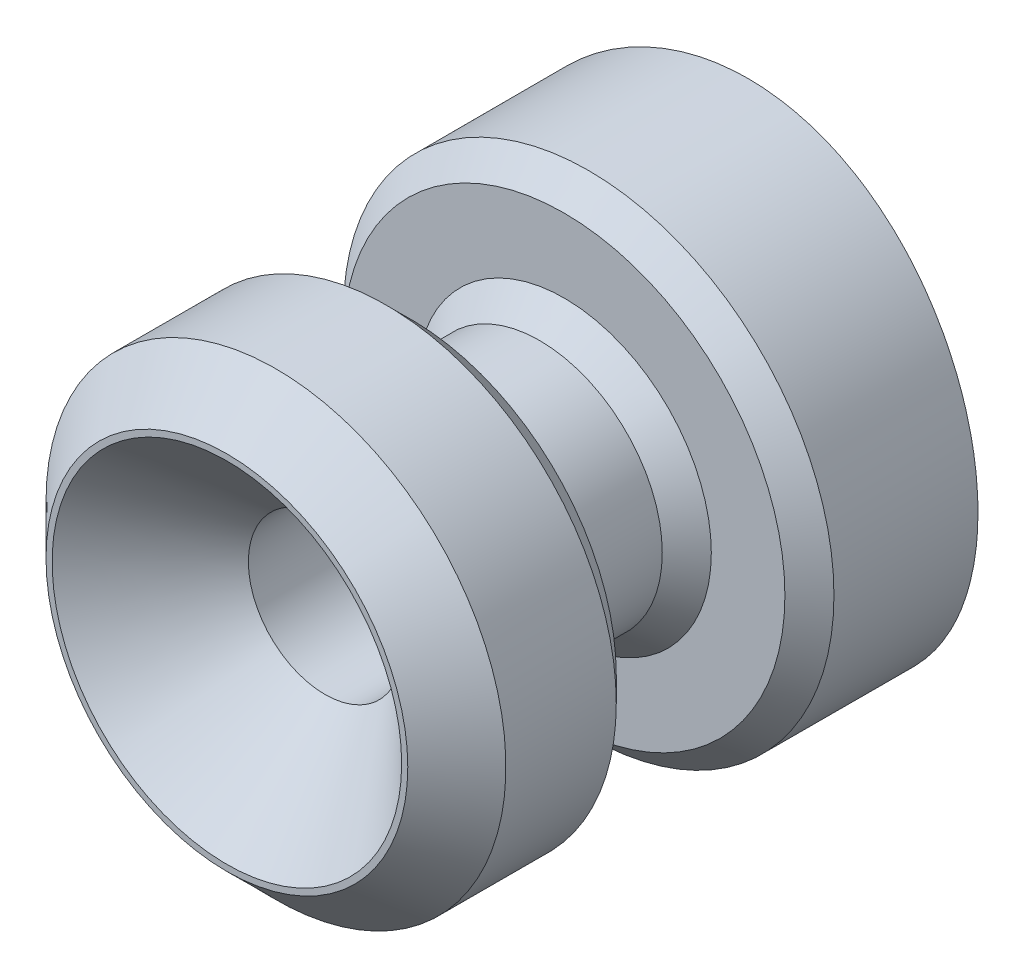
ISO-10303-21;
HEADER;
FILE_DESCRIPTION(('STEP AP214'),'2;1');
FILE_NAME('part.step','',(''),(''),'','','');
FILE_SCHEMA(('AUTOMOTIVE_DESIGN { 1 0 10303 214 1 1 1 1 }'));
ENDSEC;
DATA;
#1=APPLICATION_CONTEXT('core data for automotive mechanical design processes');
#2=APPLICATION_PROTOCOL_DEFINITION('international standard','automotive_design',2000,#1);
#3=PRODUCT_CONTEXT('',#1,'mechanical');
#4=PRODUCT('Part','Part','',(#3));
#5=PRODUCT_RELATED_PRODUCT_CATEGORY('part','',(#4));
#6=PRODUCT_DEFINITION_FORMATION('','',#4);
#7=PRODUCT_DEFINITION_CONTEXT('part definition',#1,'design');
#8=PRODUCT_DEFINITION('design','',#6,#7);
#9=PRODUCT_DEFINITION_SHAPE('','',#8);
#10=(LENGTH_UNIT() NAMED_UNIT(*) SI_UNIT(.MILLI.,.METRE.));
#11=(NAMED_UNIT(*) PLANE_ANGLE_UNIT() SI_UNIT($,.RADIAN.));
#12=(NAMED_UNIT(*) SI_UNIT($,.STERADIAN.) SOLID_ANGLE_UNIT());
#13=UNCERTAINTY_MEASURE_WITH_UNIT(LENGTH_MEASURE(1.E-05),#10,'distance_accuracy_value','');
#14=(GEOMETRIC_REPRESENTATION_CONTEXT(3) GLOBAL_UNCERTAINTY_ASSIGNED_CONTEXT((#13)) GLOBAL_UNIT_ASSIGNED_CONTEXT((#10,
#11,#12)) REPRESENTATION_CONTEXT('',''));
#15=CARTESIAN_POINT('',(0.,0.,0.));
#16=DIRECTION('',(0.,0.,1.));
#17=DIRECTION('',(1.,0.,0.));
#18=AXIS2_PLACEMENT_3D('',#15,#16,#17);
#19=CARTESIAN_POINT('',(0.,0.,3.81));
#20=DIRECTION('',(0.,0.,1.));
#21=DIRECTION('',(1.,0.,0.));
#22=AXIS2_PLACEMENT_3D('',#19,#20,#21);
#23=PLANE('',#22);
#24=CARTESIAN_POINT('',(0.,0.,3.81));
#25=DIRECTION('',(0.,0.,1.));
#26=DIRECTION('',(1.,0.,0.));
#27=AXIS2_PLACEMENT_3D('',#24,#25,#26);
#28=CIRCLE('',#27,4.572);
#29=CARTESIAN_POINT('',(4.572,0.,3.81));
#30=VERTEX_POINT('',#29);
#31=EDGE_CURVE('E150',#30,#30,#28,.T.);
#32=ORIENTED_EDGE('',*,*,#31,.T.);
#33=EDGE_LOOP('',(#32));
#34=FACE_BOUND('',#33,.T.);
#35=CARTESIAN_POINT('',(0.,0.,3.81));
#36=DIRECTION('',(0.,0.,1.));
#37=DIRECTION('',(1.,0.,0.));
#38=AXIS2_PLACEMENT_3D('',#35,#36,#37);
#39=CIRCLE('',#38,3.048);
#40=CARTESIAN_POINT('',(3.048,0.,3.81));
#41=VERTEX_POINT('',#40);
#42=EDGE_CURVE('E153',#41,#41,#39,.F.);
#43=ORIENTED_EDGE('',*,*,#42,.T.);
#44=EDGE_LOOP('',(#43));
#45=FACE_BOUND('',#44,.T.);
#46=ADVANCED_FACE('F45',(#34,#45),#23,.T.);
#47=CARTESIAN_POINT('',(0.,0.,3.81));
#48=DIRECTION('',(0.,0.,-1.));
#49=DIRECTION('',(-1.,0.,0.));
#50=AXIS2_PLACEMENT_3D('',#47,#48,#49);
#51=CYLINDRICAL_SURFACE('',#50,5.08);
#52=CARTESIAN_POINT('',(0.,0.,3.302));
#53=DIRECTION('',(0.,0.,1.));
#54=DIRECTION('',(1.,0.,0.));
#55=AXIS2_PLACEMENT_3D('',#52,#53,#54);
#56=CIRCLE('',#55,5.08);
#57=CARTESIAN_POINT('',(5.08,0.,3.302));
#58=VERTEX_POINT('',#57);
#59=EDGE_CURVE('E166',#58,#58,#56,.F.);
#60=ORIENTED_EDGE('',*,*,#59,.T.);
#61=EDGE_LOOP('',(#60));
#62=FACE_BOUND('',#61,.T.);
#63=CARTESIAN_POINT('',(-5.08,0.,0.31875001937566));
#64=CARTESIAN_POINT('',(-5.08000163113073,-0.14212836182361,0.318750566150032));
#65=CARTESIAN_POINT('',(-5.07403316462097,-0.284232778808304,0.318002963207046));
#66=CARTESIAN_POINT('',(-5.05020513729804,-0.567470692816802,0.315034608007758));
#67=CARTESIAN_POINT('',(-5.03234288122984,-0.7086039624429,0.312813521845427));
#68=CARTESIAN_POINT('',(-4.98483813146134,-0.988948562406552,0.306957685428846));
#69=CARTESIAN_POINT('',(-4.95518686587808,-1.12815838156544,0.303321882565252));
#70=CARTESIAN_POINT('',(-4.88431160310266,-1.40361370157948,0.294737793116765));
#71=CARTESIAN_POINT('',(-4.84308336701385,-1.53985809692187,0.289789025827887));
#72=CARTESIAN_POINT('',(-4.74941067179676,-1.80822465840174,0.278724686427278));
#73=CARTESIAN_POINT('',(-4.69697800769119,-1.94035099334785,0.272610342056063));
#74=CARTESIAN_POINT('',(-4.58122956635205,-2.19975337921495,0.259380368263465));
#75=CARTESIAN_POINT('',(-4.517909780811,-2.32702762258321,0.25226437023922));
#76=CARTESIAN_POINT('',(-4.38089159288009,-2.57571998640796,0.237235926656017));
#77=CARTESIAN_POINT('',(-4.30719889453834,-2.69714127645881,0.229323919498749));
#78=CARTESIAN_POINT('',(-4.14990057270835,-2.93340653028102,0.212917787464464));
#79=CARTESIAN_POINT('',(-4.06629127928907,-3.04824803554283,0.204423447571732));
#80=CARTESIAN_POINT('',(-3.88936492330744,-3.27101891574982,0.187052585695042));
#81=CARTESIAN_POINT('',(-3.79600544262105,-3.37891448194214,0.178174501362653));
#82=CARTESIAN_POINT('',(-3.60051344277048,-3.58650785851325,0.160318934752459));
#83=CARTESIAN_POINT('',(-3.4983776918065,-3.68620262232427,0.151341416928219));
#84=CARTESIAN_POINT('',(-3.28610844806059,-3.87662408599692,0.133546150740323));
#85=CARTESIAN_POINT('',(-3.17597749911965,-3.96735361683156,0.124728352664507));
#86=CARTESIAN_POINT('',(-2.94841351190853,-4.13927544505623,0.107495582106673));
#87=CARTESIAN_POINT('',(-2.83097779474471,-4.22046421162706,0.0990807594349611));
#88=CARTESIAN_POINT('',(-2.58929497340398,-4.37291948134165,0.0828719949325172));
#89=CARTESIAN_POINT('',(-2.46502845019977,-4.44415541575312,0.0750799960727926));
#90=CARTESIAN_POINT('',(-2.21083957617337,-4.57592541567181,0.0603659301386983));
#91=CARTESIAN_POINT('',(-2.0809151435836,-4.63645549989873,0.0534441869696176));
#92=CARTESIAN_POINT('',(-1.81641344827389,-4.74631753687593,0.0406768501817299));
#93=CARTESIAN_POINT('',(-1.68183806605286,-4.79565395586308,0.0348308275304209));
#94=CARTESIAN_POINT('',(-1.40894668774063,-4.88280922960741,0.0243776835248181));
#95=CARTESIAN_POINT('',(-1.27062933816786,-4.92062385457372,0.0197710172257838));
#96=CARTESIAN_POINT('',(-0.853104999601793,-5.01593579861848,0.00807316710406616));
#97=CARTESIAN_POINT('',(-0.569634614081756,-5.05600122359813,0.00301994643576346));
#98=CARTESIAN_POINT('',(-0.000106648625282325,-5.08801153685382,-0.001007352290812));
#99=CARTESIAN_POINT('',(0.285950826807928,-5.07995836024646,1.83251845966527E-05));
#100=CARTESIAN_POINT('',(0.850999934380862,-5.01622637156992,0.00799599645407532));
#101=CARTESIAN_POINT('',(1.13002257703651,-4.96081965389954,0.0149141312971703));
#102=CARTESIAN_POINT('',(1.67476735810172,-4.80436101113221,0.0338471858795426));
#103=CARTESIAN_POINT('',(1.94048922690881,-4.70330816121849,0.0458622088843922));
#104=CARTESIAN_POINT('',(2.45194854672161,-4.45813773995609,0.0736729001737078));
#105=CARTESIAN_POINT('',(2.69762872437893,-4.3139018970831,0.089478927475738));
#106=CARTESIAN_POINT('',(3.16139942478487,-3.98654322039068,0.123082863201276));
#107=CARTESIAN_POINT('',(3.37948868486126,-3.80341860789003,0.140880862715309));
#108=CARTESIAN_POINT('',(3.78346752817378,-3.40197257289941,0.176613855717224));
#109=CARTESIAN_POINT('',(3.96912405839318,-3.1834165545305,0.194548945579585));
#110=CARTESIAN_POINT('',(4.30115246029741,-2.71811937303991,0.228420152008253));
#111=CARTESIAN_POINT('',(4.44752424139581,-2.47137814492803,0.244356263965086));
#112=CARTESIAN_POINT('',(4.69682843889493,-1.95653491476076,0.272443832698414));
#113=CARTESIAN_POINT('',(4.79974626201894,-1.68842577253,0.284594017677023));
#114=CARTESIAN_POINT('',(4.95903604390691,-1.13854573535213,0.303729186364355));
#115=CARTESIAN_POINT('',(5.0154101817657,-0.856775480648674,0.310714411885945));
#116=CARTESIAN_POINT('',(5.07971028611411,-0.289586748937969,0.318701178449627));
#117=CARTESIAN_POINT('',(5.0879572976037,-0.0042052039392809,0.319742369761893));
#118=CARTESIAN_POINT('',(5.05661628327842,0.563871946018629,0.315830807678094));
#119=CARTESIAN_POINT('',(5.01702927616193,0.846567608048604,0.310878181929501));
#120=CARTESIAN_POINT('',(4.89141067621862,1.40030100013156,0.295560200376309));
#121=CARTESIAN_POINT('',(4.80553216141675,1.67137399272246,0.285212688204968));
#122=CARTESIAN_POINT('',(4.58992740106149,2.19527049705277,0.260263433280151));
#123=CARTESIAN_POINT('',(4.46019966666691,2.44809338878081,0.245661546077425));
#124=CARTESIAN_POINT('',(4.15980248706387,2.92974679210469,0.213732659000639));
#125=CARTESIAN_POINT('',(3.98892537285179,3.15844686290351,0.196391995179524));
#126=CARTESIAN_POINT('',(3.61137278726438,3.5840354602221,0.160968118573171));
#127=CARTESIAN_POINT('',(3.40469589490694,3.78092272341272,0.142884876334896));
#128=CARTESIAN_POINT('',(2.96000020663566,4.13843622552832,0.107891495570958));
#129=CARTESIAN_POINT('',(2.72180968381771,4.29884965472693,0.0909886214119196));
#130=CARTESIAN_POINT('',(2.22166716300062,4.57739035250271,0.0603896719495729));
#131=CARTESIAN_POINT('',(1.95971564146793,4.69551846876954,0.046693532363065));
#132=CARTESIAN_POINT('',(1.42022717552979,4.88579599529666,0.0241066059559148));
#133=CARTESIAN_POINT('',(1.1427329830411,4.95806537974193,0.0152032896436587));
#134=CARTESIAN_POINT('',(0.579272589379001,5.05494100299623,0.00318010243726818));
#135=CARTESIAN_POINT('',(0.293306782956508,5.07954945912084,5.99624943833791E-05));
#136=CARTESIAN_POINT('',(-0.134411618721521,5.08021543246259,-2.87323995560992E-05));
#137=CARTESIAN_POINT('',(-0.276361373160648,5.07446627928071,0.000698095490897828));
#138=CARTESIAN_POINT('',(-0.55925263261344,5.05111268000176,0.00363108561952908));
#139=CARTESIAN_POINT('',(-0.700194493454806,5.03351265015782,0.00583669678482018));
#140=CARTESIAN_POINT('',(-0.980122030989655,4.98657399560847,0.0116674563995788));
#141=CARTESIAN_POINT('',(-1.11910697717186,4.9572311016052,0.015293121121006));
#142=CARTESIAN_POINT('',(-1.39404722332105,4.88703910851081,0.0238575206777387));
#143=CARTESIAN_POINT('',(-1.53000360592088,4.84619419470355,0.0287957778584055));
#144=CARTESIAN_POINT('',(-1.79797903457522,4.75329180948177,0.0398451799473452));
#145=CARTESIAN_POINT('',(-1.92999809150583,4.70123436904296,0.045956321615402));
#146=CARTESIAN_POINT('',(-2.18913157609177,4.58630409840219,0.0591754422812408));
#147=CARTESIAN_POINT('',(-2.31624776374172,4.52343519429863,0.0662830592443239));
#148=CARTESIAN_POINT('',(-2.56479101761603,4.38729207218835,0.0812989184403335));
#149=CARTESIAN_POINT('',(-2.68621597811056,4.31401404264315,0.0892074536418581));
#150=CARTESIAN_POINT('',(-2.92244727463984,4.15761487508324,0.105597732452174));
#151=CARTESIAN_POINT('',(-3.03725596957402,4.07449727785935,0.114079269396145));
#152=CARTESIAN_POINT('',(-3.26029758954033,3.89835792977002,0.131442009731971));
#153=CARTESIAN_POINT('',(-3.36847849327999,3.80527053284176,0.140325607708864));
#154=CARTESIAN_POINT('',(-3.57658596851835,3.61036697340032,0.158182087116362));
#155=CARTESIAN_POINT('',(-3.6765155182787,3.50855398760018,0.167154935011055));
#156=CARTESIAN_POINT('',(-3.86752526701393,3.29681511605748,0.184945858159275));
#157=CARTESIAN_POINT('',(-3.95860008607726,3.18688436864898,0.193763836685347));
#158=CARTESIAN_POINT('',(-4.13116000896924,2.95977176352984,0.210987965449601));
#159=CARTESIAN_POINT('',(-4.21264864270169,2.84259259929596,0.219394266609233));
#160=CARTESIAN_POINT('',(-4.36581825878807,2.60125768989354,0.235595833520016));
#161=CARTESIAN_POINT('',(-4.43745676776914,2.47707479938353,0.243388394783979));
#162=CARTESIAN_POINT('',(-4.56997884632661,2.22310643754913,0.258099075837427));
#163=CARTESIAN_POINT('',(-4.63086636152428,2.09332304346448,0.265017516163567));
#164=CARTESIAN_POINT('',(-4.74143102497381,1.82913048926695,0.277781428347371));
#165=CARTESIAN_POINT('',(-4.79111691835747,1.69472503275872,0.28362773655105));
#166=CARTESIAN_POINT('',(-4.87895989119357,1.42219885066811,0.294086445604612));
#167=CARTESIAN_POINT('',(-4.91711969007741,1.28407900983445,0.298699137480676));
#168=CARTESIAN_POINT('',(-4.99271593355522,0.957161761318244,0.307908611324574));
#169=CARTESIAN_POINT('',(-5.02541376618946,0.767233312122201,0.311957134746613));
#170=CARTESIAN_POINT('',(-5.06905461513308,0.384855268888317,0.31737745880623));
#171=CARTESIAN_POINT('',(-5.07999779186339,0.192405693452039,0.318749279182072));
#172=CARTESIAN_POINT('',(-5.08,0.,0.31875001937566));
#173=B_SPLINE_CURVE_WITH_KNOTS('',3,(#63,#64,#65,#66,#67,#68,#69,#70,#71,#72,#73,#74,#75,#76,
#77,#78,#79,#80,#81,#82,#83,#84,#85,#86,#87,#88,#89,#90,#91,#92,#93,#94,#95,#96,#97,#98,#99,
#100,#101,#102,#103,#104,#105,#106,#107,#108,#109,#110,#111,#112,#113,#114,#115,#116,#117,#118,
#119,#120,#121,#122,#123,#124,#125,#126,#127,#128,#129,#130,#131,#132,#133,#134,#135,#136,#137,
#138,#139,#140,#141,#142,#143,#144,#145,#146,#147,#148,#149,#150,#151,#152,#153,#154,#155,#156,
#157,#158,#159,#160,#161,#162,#163,#164,#165,#166,#167,#168,#169,#170,#171,#172),.UNSPECIFIED.,
.T.,.F.,(4,2,2,2,2,2,2,2,2,2,2,2,2,2,2,2,2,2,2,2,2,2,2,2,2,2,2,2,2,2,2,2,2,2,2,2,2,2,2,2,2,2,2,
2,2,2,2,2,2,2,2,2,2,2,4),(0.,0.42621671202917,0.852530042033866,1.27916117568178,
1.70594872405771,2.13228918260283,2.55878694418745,2.98505108497337,3.41147347261958,
3.83983506676755,4.26835508366363,4.69673935042553,5.12528165646821,5.55511252226529,
5.98510289855518,6.41492140715144,6.84489751776403,7.69942333300696,8.55391478324529,
9.4035290668841,10.2531605649669,11.105140697311,11.9571598056261,12.8150697509209,
13.6729816744474,14.5311814844551,15.3893411127537,16.2417695524328,17.0941798386681,
17.9437884903027,18.7934259921531,19.6474447026945,20.5014973191307,21.3604119362228,
22.2193093337706,23.0759503445773,23.9325515011648,24.3583410155239,24.7839719463094,
25.2097577625144,25.6353888461618,26.0610187539757,26.4864944227561,26.9121262926952,
27.3376054609788,27.7660819641137,28.1944031297448,28.6229829272412,29.0514044122784,
29.4816188878545,29.9116751447929,30.3413944841318,30.7710123574687,31.3480057577817,
31.924994903274),.UNSPECIFIED.);
#174=CARTESIAN_POINT('',(-5.08,0.,0.31875001937566));
#175=VERTEX_POINT('',#174);
#176=EDGE_CURVE('E75',#175,#175,#173,.T.);
#177=ORIENTED_EDGE('',*,*,#176,.T.);
#178=EDGE_LOOP('',(#177));
#179=FACE_BOUND('',#178,.T.);
#180=ADVANCED_FACE('F100',(#62,#179),#51,.T.);
#181=CARTESIAN_POINT('',(0.,0.,3.81));
#182=DIRECTION('',(0.,0.,-1.));
#183=DIRECTION('',(-1.,0.,0.));
#184=AXIS2_PLACEMENT_3D('',#181,#182,#183);
#185=CYLINDRICAL_SURFACE('',#184,1.5875);
#186=CARTESIAN_POINT('',(-1.5875,0.,0.31875001937566));
#187=CARTESIAN_POINT('',(-1.58749605856774,-0.0891340965976005,0.318749602770961));
#188=CARTESIAN_POINT('',(-1.57996781607146,-0.178331957866142,0.318453634196682));
#189=CARTESIAN_POINT('',(-1.55004203250648,-0.354268623532587,0.317301409661173));
#190=CARTESIAN_POINT('',(-1.52762682460376,-0.441004378392128,0.316444488016504));
#191=CARTESIAN_POINT('',(-1.46856843611169,-0.609442652705967,0.314267379944734));
#192=CARTESIAN_POINT('',(-1.43193232965997,-0.691147651315895,0.312947423883911));
#193=CARTESIAN_POINT('',(-1.34548254328847,-0.84722539295387,0.309993045425472));
#194=CARTESIAN_POINT('',(-1.29567203862694,-0.921599896837192,0.308358698827272));
#195=CARTESIAN_POINT('',(-1.18424925195593,-1.06097807002339,0.304958267804353));
#196=CARTESIAN_POINT('',(-1.12263013480184,-1.12597627369039,0.303192107445534));
#197=CARTESIAN_POINT('',(-0.989352208523133,-1.24471045835753,0.299727767928321));
#198=CARTESIAN_POINT('',(-0.917692995779004,-1.29844598637266,0.298029591506464));
#199=CARTESIAN_POINT('',(-0.766343785087821,-1.39314185751348,0.294892246384188));
#200=CARTESIAN_POINT('',(-0.686651369414355,-1.43409833929221,0.293453156025284));
#201=CARTESIAN_POINT('',(-0.521515032137218,-1.50204861652636,0.290997096697537));
#202=CARTESIAN_POINT('',(-0.43607114163829,-1.52904248748659,0.28998012544603));
#203=CARTESIAN_POINT('',(-0.261903897935971,-1.5682879511736,0.288483612030081));
#204=CARTESIAN_POINT('',(-0.173182256172791,-1.5805471283809,0.288003793382473));
#205=CARTESIAN_POINT('',(0.00506085660006182,-1.58999859672801,0.287634858722471));
#206=CARTESIAN_POINT('',(0.0945823231948204,-1.5871909709831,0.287745739451513));
#207=CARTESIAN_POINT('',(0.2718324201537,-1.56659488702525,0.28854544250986));
#208=CARTESIAN_POINT('',(0.359562004043119,-1.54881462089241,0.289233948798291));
#209=CARTESIAN_POINT('',(0.53079021460999,-1.49879065649175,0.291110795641882));
#210=CARTESIAN_POINT('',(0.614288828614523,-1.4665469149047,0.292299137694089));
#211=CARTESIAN_POINT('',(0.774711280327412,-1.38850189343176,0.295042069792218));
#212=CARTESIAN_POINT('',(0.851633293150991,-1.3426968661748,0.296596761046635));
#213=CARTESIAN_POINT('',(0.996699023610568,-1.23883226339463,0.299897039081049));
#214=CARTESIAN_POINT('',(1.06484270478852,-1.18077263697843,0.301642626653819));
#215=CARTESIAN_POINT('',(1.19046512297854,-1.05400064134533,0.305129337348357));
#216=CARTESIAN_POINT('',(1.24793669677159,-0.985281173520005,0.306870456703495));
#217=CARTESIAN_POINT('',(1.35052832486205,-0.839165189447816,0.310150842467397));
#218=CARTESIAN_POINT('',(1.39564837680467,-0.761768671546705,0.311690108837677));
#219=CARTESIAN_POINT('',(1.47225541520178,-0.600491523788872,0.314393325712685));
#220=CARTESIAN_POINT('',(1.50374216663722,-0.516610782182575,0.315557269747291));
#221=CARTESIAN_POINT('',(1.55218419476718,-0.344748070836565,0.317378547148455));
#222=CARTESIAN_POINT('',(1.56913953808768,-0.256766119902705,0.318035882837791));
#223=CARTESIAN_POINT('',(1.58802865214714,-0.0792606974956064,0.318769553929811));
#224=CARTESIAN_POINT('',(1.58997233336054,0.0102617178488107,0.31884627264645));
#225=CARTESIAN_POINT('',(1.5788087900623,0.188361523085308,0.318411078785152));
#226=CARTESIAN_POINT('',(1.56570159562339,0.276938914865255,0.317899167383339));
#227=CARTESIAN_POINT('',(1.52481656838522,0.450606601681935,0.316344639307881));
#228=CARTESIAN_POINT('',(1.49704324539505,0.535697960005294,0.315302185778587));
#229=CARTESIAN_POINT('',(1.42761891653306,0.700010840071209,0.312804001587597));
#230=CARTESIAN_POINT('',(1.3859678623337,0.779232341371505,0.31134826948671));
#231=CARTESIAN_POINT('',(1.28994492680257,0.929602275297363,0.308186473445931));
#232=CARTESIAN_POINT('',(1.23556638570495,1.00074645235126,0.30648027862414));
#233=CARTESIAN_POINT('',(1.11564184267787,1.13289945706889,0.303010228906602));
#234=CARTESIAN_POINT('',(1.05009579541018,1.19390824358263,0.301246373776787));
#235=CARTESIAN_POINT('',(0.909654314710353,1.30409185812578,0.297858742070753));
#236=CARTESIAN_POINT('',(0.834753857326931,1.35326028521458,0.296235041565541));
#237=CARTESIAN_POINT('',(0.677755219270757,1.43832372627602,0.293311990450955));
#238=CARTESIAN_POINT('',(0.595657060754842,1.47421878110659,0.292012638843177));
#239=CARTESIAN_POINT('',(0.426617433733569,1.53170534611213,0.28988533635364));
#240=CARTESIAN_POINT('',(0.339677367214829,1.5533009736179,0.289057249787009));
#241=CARTESIAN_POINT('',(0.163402088300515,1.58158914589806,0.287965466404174));
#242=CARTESIAN_POINT('',(0.074066882497654,1.58828173168938,0.28770176803463));
#243=CARTESIAN_POINT('',(-0.10439892453149,1.58657337850295,0.28776854226202));
#244=CARTESIAN_POINT('',(-0.1935296225726,1.57818251945256,0.288098618053125));
#245=CARTESIAN_POINT('',(-0.36911605689391,1.54656624474876,0.289314897450854));
#246=CARTESIAN_POINT('',(-0.455571787940722,1.52334080007443,0.290201102145432));
#247=CARTESIAN_POINT('',(-0.623356956054783,1.46271642733837,0.292429667399068));
#248=CARTESIAN_POINT('',(-0.704686321615433,1.42531730162195,0.293772034319368));
#249=CARTESIAN_POINT('',(-0.859911168228764,1.33740955689795,0.296761558024999));
#250=CARTESIAN_POINT('',(-0.933806902018494,1.28690138379582,0.298408704442682));
#251=CARTESIAN_POINT('',(-1.07211576515792,1.17417546511891,0.301823321451318));
#252=CARTESIAN_POINT('',(-1.13652355234725,1.11195116738994,0.30359085901537));
#253=CARTESIAN_POINT('',(-1.25399732368388,0.977554740980103,0.307046750258525));
#254=CARTESIAN_POINT('',(-1.30706050273228,0.905380159204379,0.308735084273174));
#255=CARTESIAN_POINT('',(-1.40035392947453,0.753092663122386,0.311843088986572));
#256=CARTESIAN_POINT('',(-1.4405742834334,0.672973690658429,0.313262552214385));
#257=CARTESIAN_POINT('',(-1.50694538860635,0.507175797638242,0.315669412242558));
#258=CARTESIAN_POINT('',(-1.53311285520273,0.421503619021761,0.316657322097198));
#259=CARTESIAN_POINT('',(-1.56372842395975,0.279411414912127,0.31782679216364));
#260=CARTESIAN_POINT('',(-1.57263148430307,0.22391294911184,0.318171492637282));
#261=CARTESIAN_POINT('',(-1.58451851238394,0.112284758226023,0.31863323741727));
#262=CARTESIAN_POINT('',(-1.58750248312676,0.0561550334610137,0.318750281839204));
#263=CARTESIAN_POINT('',(-1.5875,0.,0.31875001937566));
#264=B_SPLINE_CURVE_WITH_KNOTS('',3,(#186,#187,#188,#189,#190,#191,#192,#193,#194,#195,#196,
#197,#198,#199,#200,#201,#202,#203,#204,#205,#206,#207,#208,#209,#210,#211,#212,#213,#214,#215,
#216,#217,#218,#219,#220,#221,#222,#223,#224,#225,#226,#227,#228,#229,#230,#231,#232,#233,#234,
#235,#236,#237,#238,#239,#240,#241,#242,#243,#244,#245,#246,#247,#248,#249,#250,#251,#252,#253,
#254,#255,#256,#257,#258,#259,#260,#261,#262,#263),.UNSPECIFIED.,.T.,.F.,(4,2,2,2,2,2,2,2,2,2,2,
2,2,2,2,2,2,2,2,2,2,2,2,2,2,2,2,2,2,2,2,2,2,2,2,2,2,2,4),(0.,0.267197311333256,
0.534712282143533,0.802094348728621,1.06941203023393,1.33688491237008,1.60436855020716,
1.87193293343927,2.1394958697637,2.40692102269202,2.67434470038419,2.94162215578066,
3.20890041169922,3.47625259328657,3.74360588520157,4.01113798359801,4.27867013299845,
4.54620689409544,4.81374242853919,5.08110132492074,5.34845968710115,5.61573588488112,
5.88301301342861,6.15043031091435,6.41784869409625,6.68541132169266,6.95297312567424,
7.22045785523602,7.48794184861131,7.75524715489063,8.02255298410128,8.28986254108029,
8.55716300669181,8.82461340446757,9.09212985647383,9.3598519008506,9.62725479059579,
9.79559083874709,9.96392680142982),.UNSPECIFIED.);
#265=CARTESIAN_POINT('',(-1.5875,0.,0.31875001937566));
#266=VERTEX_POINT('',#265);
#267=EDGE_CURVE('E67',#266,#266,#264,.T.);
#268=ORIENTED_EDGE('',*,*,#267,.F.);
#269=EDGE_LOOP('',(#268));
#270=FACE_BOUND('',#269,.T.);
#271=CARTESIAN_POINT('',(0.,0.,8.76299999999999));
#272=DIRECTION('',(0.,0.,1.));
#273=DIRECTION('',(1.,0.,0.));
#274=AXIS2_PLACEMENT_3D('',#271,#272,#273);
#275=CIRCLE('',#274,1.5875);
#276=CARTESIAN_POINT('',(1.5875,0.,8.76299999999999));
#277=VERTEX_POINT('',#276);
#278=EDGE_CURVE('E64',#277,#277,#275,.T.);
#279=ORIENTED_EDGE('',*,*,#278,.T.);
#280=EDGE_LOOP('',(#279));
#281=FACE_BOUND('',#280,.T.);
#282=ADVANCED_FACE('F77',(#270,#281),#185,.F.);
#283=CARTESIAN_POINT('',(0.,0.,6.985));
#284=DIRECTION('',(0.,0.,-1.));
#285=DIRECTION('',(-1.,0.,0.));
#286=AXIS2_PLACEMENT_3D('',#283,#284,#285);
#287=CYLINDRICAL_SURFACE('',#286,2.54);
#288=CARTESIAN_POINT('',(0.,0.,4.31800000000001));
#289=DIRECTION('',(0.,0.,1.));
#290=DIRECTION('',(1.,0.,0.));
#291=AXIS2_PLACEMENT_3D('',#288,#289,#290);
#292=CIRCLE('',#291,2.54);
#293=CARTESIAN_POINT('',(2.54,0.,4.31800000000001));
#294=VERTEX_POINT('',#293);
#295=EDGE_CURVE('E156',#294,#294,#292,.T.);
#296=ORIENTED_EDGE('',*,*,#295,.T.);
#297=EDGE_LOOP('',(#296));
#298=FACE_BOUND('',#297,.T.);
#299=CARTESIAN_POINT('',(0.,0.,6.477));
#300=DIRECTION('',(0.,0.,1.));
#301=DIRECTION('',(1.,0.,0.));
#302=AXIS2_PLACEMENT_3D('',#299,#300,#301);
#303=CIRCLE('',#302,2.54);
#304=CARTESIAN_POINT('',(2.54,0.,6.477));
#305=VERTEX_POINT('',#304);
#306=EDGE_CURVE('E98',#305,#305,#303,.F.);
#307=ORIENTED_EDGE('',*,*,#306,.T.);
#308=EDGE_LOOP('',(#307));
#309=FACE_BOUND('',#308,.T.);
#310=ADVANCED_FACE('F182',(#298,#309),#287,.T.);
#311=CARTESIAN_POINT('',(0.,0.,10.795));
#312=DIRECTION('',(0.,0.,1.));
#313=DIRECTION('',(1.,0.,0.));
#314=AXIS2_PLACEMENT_3D('',#311,#312,#313);
#315=PLANE('',#314);
#316=CARTESIAN_POINT('',(0.,0.,10.795));
#317=DIRECTION('',(0.,0.,1.));
#318=DIRECTION('',(1.,0.,0.));
#319=AXIS2_PLACEMENT_3D('',#316,#317,#318);
#320=CIRCLE('',#319,3.74650000000002);
#321=CARTESIAN_POINT('',(3.74650000000002,0.,10.795));
#322=VERTEX_POINT('',#321);
#323=EDGE_CURVE('E54',#322,#322,#320,.T.);
#324=ORIENTED_EDGE('',*,*,#323,.T.);
#325=EDGE_LOOP('',(#324));
#326=FACE_BOUND('',#325,.T.);
#327=CARTESIAN_POINT('',(0.,0.,10.795));
#328=DIRECTION('',(0.,0.,1.));
#329=DIRECTION('',(1.,0.,0.));
#330=AXIS2_PLACEMENT_3D('',#327,#328,#329);
#331=CIRCLE('',#330,3.61950000000002);
#332=CARTESIAN_POINT('',(3.61950000000002,0.,10.795));
#333=VERTEX_POINT('',#332);
#334=EDGE_CURVE('E59',#333,#333,#331,.F.);
#335=ORIENTED_EDGE('',*,*,#334,.T.);
#336=EDGE_LOOP('',(#335));
#337=FACE_BOUND('',#336,.T.);
#338=ADVANCED_FACE('F87',(#326,#337),#315,.T.);
#339=CARTESIAN_POINT('',(0.,0.,6.985));
#340=DIRECTION('',(0.,0.,1.));
#341=DIRECTION('',(1.,0.,0.));
#342=AXIS2_PLACEMENT_3D('',#339,#340,#341);
#343=PLANE('',#342);
#344=CARTESIAN_POINT('',(0.,0.,6.985));
#345=DIRECTION('',(0.,0.,1.));
#346=DIRECTION('',(1.,0.,0.));
#347=AXIS2_PLACEMENT_3D('',#344,#345,#346);
#348=CIRCLE('',#347,4.25449999999999);
#349=CARTESIAN_POINT('',(4.25449999999999,0.,6.985));
#350=VERTEX_POINT('',#349);
#351=EDGE_CURVE('E174',#350,#350,#348,.F.);
#352=ORIENTED_EDGE('',*,*,#351,.T.);
#353=EDGE_LOOP('',(#352));
#354=FACE_BOUND('',#353,.T.);
#355=CARTESIAN_POINT('',(0.,0.,6.985));
#356=DIRECTION('',(0.,0.,1.));
#357=DIRECTION('',(1.,0.,0.));
#358=AXIS2_PLACEMENT_3D('',#355,#356,#357);
#359=CIRCLE('',#358,3.048);
#360=CARTESIAN_POINT('',(3.048,0.,6.985));
#361=VERTEX_POINT('',#360);
#362=EDGE_CURVE('E155',#361,#361,#359,.T.);
#363=ORIENTED_EDGE('',*,*,#362,.T.);
#364=EDGE_LOOP('',(#363));
#365=FACE_BOUND('',#364,.T.);
#366=ADVANCED_FACE('F195',(#354,#365),#343,.F.);
#367=CARTESIAN_POINT('',(0.,0.,10.795));
#368=DIRECTION('',(0.,0.,-1.));
#369=DIRECTION('',(-1.,0.,0.));
#370=AXIS2_PLACEMENT_3D('',#367,#368,#369);
#371=CYLINDRICAL_SURFACE('',#370,4.7625);
#372=CARTESIAN_POINT('',(0.,0.,9.77900000000001));
#373=DIRECTION('',(0.,0.,1.));
#374=DIRECTION('',(1.,0.,0.));
#375=AXIS2_PLACEMENT_3D('',#372,#373,#374);
#376=CIRCLE('',#375,4.7625);
#377=CARTESIAN_POINT('',(-4.7625,0.,9.77900000000001));
#378=VERTEX_POINT('',#377);
#379=EDGE_CURVE('E10',#378,#378,#376,.F.);
#380=CARTESIAN_POINT('',(0.,0.,7.49300000000001));
#381=DIRECTION('',(0.,0.,1.));
#382=DIRECTION('',(1.,0.,0.));
#383=AXIS2_PLACEMENT_3D('',#380,#381,#382);
#384=CIRCLE('',#383,4.7625);
#385=CARTESIAN_POINT('',(-4.7625,0.,7.49300000000001));
#386=VERTEX_POINT('',#385);
#387=EDGE_CURVE('E170',#386,#386,#384,.T.);
#388=CARTESIAN_POINT('',(-4.7625,0.,9.77900000000001));
#389=CARTESIAN_POINT('',(-4.7625,0.,9.75518750000001));
#390=CARTESIAN_POINT('',(-4.7625,0.,9.73137500000001));
#391=CARTESIAN_POINT('',(-4.7625,0.,9.68375000000001));
#392=CARTESIAN_POINT('',(-4.7625,0.,9.65993750000001));
#393=CARTESIAN_POINT('',(-4.7625,0.,9.61231250000001));
#394=CARTESIAN_POINT('',(-4.7625,0.,9.58850000000001));
#395=CARTESIAN_POINT('',(-4.7625,0.,9.54087500000001));
#396=CARTESIAN_POINT('',(-4.7625,0.,9.51706250000001));
#397=CARTESIAN_POINT('',(-4.7625,0.,9.46943750000001));
#398=CARTESIAN_POINT('',(-4.7625,0.,9.44562500000001));
#399=CARTESIAN_POINT('',(-4.7625,0.,9.39800000000001));
#400=CARTESIAN_POINT('',(-4.7625,0.,9.37418750000001));
#401=CARTESIAN_POINT('',(-4.7625,0.,9.32656250000001));
#402=CARTESIAN_POINT('',(-4.7625,0.,9.30275000000001));
#403=CARTESIAN_POINT('',(-4.7625,0.,9.25512500000001));
#404=CARTESIAN_POINT('',(-4.7625,0.,9.23131250000001));
#405=CARTESIAN_POINT('',(-4.7625,0.,9.18368750000001));
#406=CARTESIAN_POINT('',(-4.7625,0.,9.15987500000001));
#407=CARTESIAN_POINT('',(-4.7625,0.,9.11225000000001));
#408=CARTESIAN_POINT('',(-4.7625,0.,9.08843750000001));
#409=CARTESIAN_POINT('',(-4.7625,0.,9.04081250000001));
#410=CARTESIAN_POINT('',(-4.7625,0.,9.01700000000001));
#411=CARTESIAN_POINT('',(-4.7625,0.,8.96937500000001));
#412=CARTESIAN_POINT('',(-4.7625,0.,8.94556250000001));
#413=CARTESIAN_POINT('',(-4.7625,0.,8.89793750000001));
#414=CARTESIAN_POINT('',(-4.7625,0.,8.87412500000001));
#415=CARTESIAN_POINT('',(-4.7625,0.,8.82650000000001));
#416=CARTESIAN_POINT('',(-4.7625,0.,8.80268750000001));
#417=CARTESIAN_POINT('',(-4.7625,0.,8.75506250000001));
#418=CARTESIAN_POINT('',(-4.7625,0.,8.73125000000001));
#419=CARTESIAN_POINT('',(-4.7625,0.,8.68362500000001));
#420=CARTESIAN_POINT('',(-4.7625,0.,8.65981250000001));
#421=CARTESIAN_POINT('',(-4.7625,0.,8.61218750000001));
#422=CARTESIAN_POINT('',(-4.7625,0.,8.58837500000001));
#423=CARTESIAN_POINT('',(-4.7625,0.,8.54075000000001));
#424=CARTESIAN_POINT('',(-4.7625,0.,8.51693750000001));
#425=CARTESIAN_POINT('',(-4.7625,0.,8.46931250000001));
#426=CARTESIAN_POINT('',(-4.7625,0.,8.44550000000001));
#427=CARTESIAN_POINT('',(-4.7625,0.,8.39787500000001));
#428=CARTESIAN_POINT('',(-4.7625,0.,8.37406250000001));
#429=CARTESIAN_POINT('',(-4.7625,0.,8.32643750000001));
#430=CARTESIAN_POINT('',(-4.7625,0.,8.30262500000001));
#431=CARTESIAN_POINT('',(-4.7625,0.,8.25500000000001));
#432=CARTESIAN_POINT('',(-4.7625,0.,8.23118750000001));
#433=CARTESIAN_POINT('',(-4.7625,0.,8.18356250000001));
#434=CARTESIAN_POINT('',(-4.7625,0.,8.15975000000001));
#435=CARTESIAN_POINT('',(-4.7625,0.,8.11212500000001));
#436=CARTESIAN_POINT('',(-4.7625,0.,8.08831250000001));
#437=CARTESIAN_POINT('',(-4.7625,0.,8.04068750000001));
#438=CARTESIAN_POINT('',(-4.7625,0.,8.01687500000001));
#439=CARTESIAN_POINT('',(-4.7625,0.,7.96925000000001));
#440=CARTESIAN_POINT('',(-4.7625,0.,7.94543750000001));
#441=CARTESIAN_POINT('',(-4.7625,0.,7.89781250000001));
#442=CARTESIAN_POINT('',(-4.7625,0.,7.87400000000001));
#443=CARTESIAN_POINT('',(-4.7625,0.,7.82637500000001));
#444=CARTESIAN_POINT('',(-4.7625,0.,7.80256250000001));
#445=CARTESIAN_POINT('',(-4.7625,0.,7.75493750000001));
#446=CARTESIAN_POINT('',(-4.7625,0.,7.73112500000001));
#447=CARTESIAN_POINT('',(-4.7625,0.,7.68350000000001));
#448=CARTESIAN_POINT('',(-4.7625,0.,7.65968750000001));
#449=CARTESIAN_POINT('',(-4.7625,0.,7.61206250000001));
#450=CARTESIAN_POINT('',(-4.7625,0.,7.58825000000001));
#451=CARTESIAN_POINT('',(-4.7625,0.,7.54062500000001));
#452=CARTESIAN_POINT('',(-4.7625,0.,7.51681250000001));
#453=CARTESIAN_POINT('',(-4.7625,0.,7.49300000000001));
#454=B_SPLINE_CURVE_WITH_KNOTS('',3,(#388,#389,#390,#391,#392,#393,#394,#395,#396,#397,#398,
#399,#400,#401,#402,#403,#404,#405,#406,#407,#408,#409,#410,#411,#412,#413,#414,#415,#416,#417,
#418,#419,#420,#421,#422,#423,#424,#425,#426,#427,#428,#429,#430,#431,#432,#433,#434,#435,#436,
#437,#438,#439,#440,#441,#442,#443,#444,#445,#446,#447,#448,#449,#450,#451,#452,#453),
.UNSPECIFIED.,.F.,.F.,(4,2,2,2,2,2,2,2,2,2,2,2,2,2,2,2,2,2,2,2,2,2,2,2,2,2,2,2,2,2,2,2,4),(0.,
0.0714374999999986,0.142874999999999,0.214312499999999,0.28575,0.3571875,0.428625,
0.500062500000001,0.571499999999999,0.642937499999999,0.714375,0.7858125,0.85725,
0.928687499999999,1.000125,1.0715625,1.143,1.2144375,1.285875,1.3573125,1.42875,1.5001875,
1.571625,1.6430625,1.7145,1.7859375,1.857375,1.9288125,2.00025,2.0716875,2.143125,2.2145625,
2.286),.UNSPECIFIED.);
#455=EDGE_CURVE('BSEAM113',#378,#386,#454,.T.);
#456=ORIENTED_EDGE('',*,*,#379,.T.);
#457=ORIENTED_EDGE('',*,*,#387,.T.);
#458=ORIENTED_EDGE('',*,*,#455,.T.);
#459=ORIENTED_EDGE('',*,*,#455,.F.);
#460=EDGE_LOOP('',(#456,#458,#457,#459));
#461=FACE_BOUND('',#460,.T.);
#462=ADVANCED_FACE('F113',(#461),#371,.T.);
#463=CARTESIAN_POINT('',(0.,0.,4.31800000000001));
#464=DIRECTION('',(0.,0.,-1.));
#465=DIRECTION('',(-1.,0.,0.));
#466=AXIS2_PLACEMENT_3D('',#463,#464,#465);
#467=CONICAL_SURFACE('',#466,2.54,0.785398163397444);
#468=ORIENTED_EDGE('',*,*,#42,.F.);
#469=EDGE_LOOP('',(#468));
#470=FACE_BOUND('',#469,.T.);
#471=ORIENTED_EDGE('',*,*,#295,.F.);
#472=EDGE_LOOP('',(#471));
#473=FACE_BOUND('',#472,.T.);
#474=ADVANCED_FACE('F106',(#470,#473),#467,.T.);
#475=CARTESIAN_POINT('',(0.,0.,6.985));
#476=DIRECTION('',(0.,0.,1.));
#477=DIRECTION('',(1.,0.,0.));
#478=AXIS2_PLACEMENT_3D('',#475,#476,#477);
#479=CONICAL_SURFACE('',#478,3.048,0.785398163397453);
#480=ORIENTED_EDGE('',*,*,#306,.F.);
#481=EDGE_LOOP('',(#480));
#482=FACE_BOUND('',#481,.T.);
#483=ORIENTED_EDGE('',*,*,#362,.F.);
#484=EDGE_LOOP('',(#483));
#485=FACE_BOUND('',#484,.T.);
#486=ADVANCED_FACE('F112',(#482,#485),#479,.T.);
#487=CARTESIAN_POINT('',(0.,0.,3.81));
#488=DIRECTION('',(0.,0.,-1.));
#489=DIRECTION('',(-1.,0.,0.));
#490=AXIS2_PLACEMENT_3D('',#487,#488,#489);
#491=CONICAL_SURFACE('',#490,4.572,0.785398163397448);
#492=ORIENTED_EDGE('',*,*,#59,.F.);
#493=EDGE_LOOP('',(#492));
#494=FACE_BOUND('',#493,.T.);
#495=ORIENTED_EDGE('',*,*,#31,.F.);
#496=EDGE_LOOP('',(#495));
#497=FACE_BOUND('',#496,.T.);
#498=ADVANCED_FACE('F120',(#494,#497),#491,.T.);
#499=CARTESIAN_POINT('',(0.,0.,7.49300000000001));
#500=DIRECTION('',(0.,0.,1.));
#501=DIRECTION('',(1.,0.,0.));
#502=AXIS2_PLACEMENT_3D('',#499,#500,#501);
#503=CONICAL_SURFACE('',#502,4.7625,0.78539816339745);
#504=ORIENTED_EDGE('',*,*,#351,.F.);
#505=EDGE_LOOP('',(#504));
#506=FACE_BOUND('',#505,.T.);
#507=ORIENTED_EDGE('',*,*,#387,.F.);
#508=EDGE_LOOP('',(#507));
#509=FACE_BOUND('',#508,.T.);
#510=ADVANCED_FACE('F127',(#506,#509),#503,.T.);
#511=CARTESIAN_POINT('',(0.,0.,8.76299999999999));
#512=DIRECTION('',(0.,0.,1.));
#513=DIRECTION('',(1.,0.,0.));
#514=AXIS2_PLACEMENT_3D('',#511,#512,#513);
#515=CONICAL_SURFACE('',#514,1.5875,0.78539816339745);
#516=ORIENTED_EDGE('',*,*,#334,.F.);
#517=EDGE_LOOP('',(#516));
#518=FACE_BOUND('',#517,.T.);
#519=ORIENTED_EDGE('',*,*,#278,.F.);
#520=EDGE_LOOP('',(#519));
#521=FACE_BOUND('',#520,.T.);
#522=ADVANCED_FACE('F85',(#518,#521),#515,.F.);
#523=CARTESIAN_POINT('',(-5.08,0.,-40.3212499806244));
#524=DIRECTION('',(1.,0.,0.));
#525=DIRECTION('',(0.,0.,-1.));
#526=AXIS2_PLACEMENT_3D('',#523,#524,#525);
#527=CYLINDRICAL_SURFACE('',#526,40.64);
#528=ORIENTED_EDGE('',*,*,#267,.T.);
#529=EDGE_LOOP('',(#528));
#530=FACE_BOUND('',#529,.T.);
#531=ORIENTED_EDGE('',*,*,#176,.F.);
#532=EDGE_LOOP('',(#531));
#533=FACE_BOUND('',#532,.T.);
#534=ADVANCED_FACE('F81',(#530,#533),#527,.F.);
#535=CARTESIAN_POINT('',(0.,0.,10.795));
#536=DIRECTION('',(0.,0.,-1.));
#537=DIRECTION('',(-1.,0.,0.));
#538=AXIS2_PLACEMENT_3D('',#535,#536,#537);
#539=CONICAL_SURFACE('',#538,3.74650000000002,0.785398163397446);
#540=ORIENTED_EDGE('',*,*,#379,.F.);
#541=EDGE_LOOP('',(#540));
#542=FACE_BOUND('',#541,.T.);
#543=ORIENTED_EDGE('',*,*,#323,.F.);
#544=EDGE_LOOP('',(#543));
#545=FACE_BOUND('',#544,.T.);
#546=ADVANCED_FACE('F48',(#542,#545),#539,.T.);
#547=CLOSED_SHELL('',(#46,#180,#282,#310,#338,#366,#462,#474,#486,#498,#510,#522,#534,#546));
#548=MANIFOLD_SOLID_BREP('B2',#547);
#549=ADVANCED_BREP_SHAPE_REPRESENTATION('',(#18,#548),#14);
#550=SHAPE_DEFINITION_REPRESENTATION(#9,#549);
ENDSEC;
END-ISO-10303-21;
